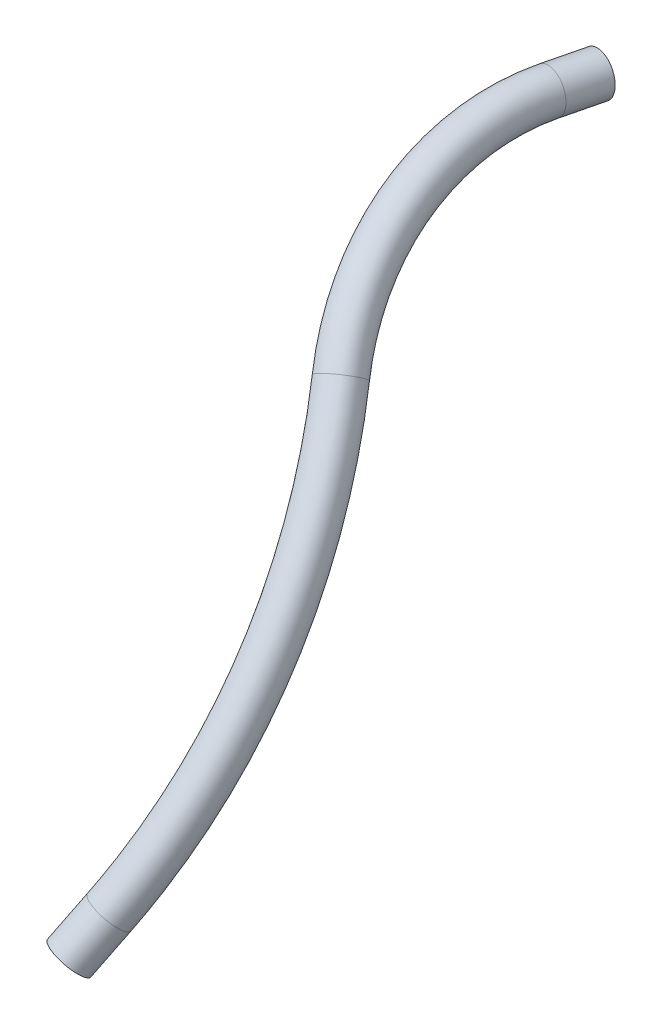
ISO-10303-21;
HEADER;
FILE_DESCRIPTION(('STEP AP214'),'2;1');
FILE_NAME('part.step','',(''),(''),'','','');
FILE_SCHEMA(('AUTOMOTIVE_DESIGN { 1 0 10303 214 1 1 1 1 }'));
ENDSEC;
DATA;
#1=APPLICATION_CONTEXT('core data for automotive mechanical design processes');
#2=APPLICATION_PROTOCOL_DEFINITION('international standard','automotive_design',2000,#1);
#3=PRODUCT_CONTEXT('',#1,'mechanical');
#4=PRODUCT('Part','Part','',(#3));
#5=PRODUCT_RELATED_PRODUCT_CATEGORY('part','',(#4));
#6=PRODUCT_DEFINITION_FORMATION('','',#4);
#7=PRODUCT_DEFINITION_CONTEXT('part definition',#1,'design');
#8=PRODUCT_DEFINITION('design','',#6,#7);
#9=PRODUCT_DEFINITION_SHAPE('','',#8);
#10=(LENGTH_UNIT() NAMED_UNIT(*) SI_UNIT(.MILLI.,.METRE.));
#11=(NAMED_UNIT(*) PLANE_ANGLE_UNIT() SI_UNIT($,.RADIAN.));
#12=(NAMED_UNIT(*) SI_UNIT($,.STERADIAN.) SOLID_ANGLE_UNIT());
#13=UNCERTAINTY_MEASURE_WITH_UNIT(LENGTH_MEASURE(1.E-05),#10,'distance_accuracy_value','');
#14=(GEOMETRIC_REPRESENTATION_CONTEXT(3) GLOBAL_UNCERTAINTY_ASSIGNED_CONTEXT((#13)) GLOBAL_UNIT_ASSIGNED_CONTEXT((#10,
#11,#12)) REPRESENTATION_CONTEXT('',''));
#15=CARTESIAN_POINT('',(0.,0.,0.));
#16=DIRECTION('',(0.,0.,1.));
#17=DIRECTION('',(1.,0.,0.));
#18=AXIS2_PLACEMENT_3D('',#15,#16,#17);
#19=CARTESIAN_POINT('',(63.0805870079191,56.0149638985559,-75.8190557243082));
#20=DIRECTION('',(0.169140527101116,-0.0574278294622898,-0.983917438861212));
#21=DIRECTION('',(-0.125092606532321,0.988976689373794,-0.0792271901950332));
#22=AXIS2_PLACEMENT_3D('',#19,#20,#21);
#23=PLANE('',#22);
#24=CARTESIAN_POINT('',(63.0805870079191,56.014963898556,-75.8190557243082));
#25=DIRECTION('',(0.169140527101116,-0.0574278294622898,-0.983917438861212));
#26=DIRECTION('',(-0.985543921030288,0.,-0.169420127848631));
#27=AXIS2_PLACEMENT_3D('',#24,#25,#26);
#28=CIRCLE('',#27,6.35);
#29=CARTESIAN_POINT('',(56.8223831093768,56.014963898556,-76.894873536147));
#30=VERTEX_POINT('',#29);
#31=EDGE_CURVE('E94',#30,#30,#28,.T.);
#32=ORIENTED_EDGE('',*,*,#31,.F.);
#33=EDGE_LOOP('',(#32));
#34=FACE_BOUND('',#33,.T.);
#35=CARTESIAN_POINT('',(63.0805870079191,56.0149638985559,-75.8190557243082));
#36=DIRECTION('',(0.169140527101116,-0.0574278294622898,-0.983917438861212));
#37=DIRECTION('',(-0.125092606532321,0.988976689373794,-0.0792271901950332));
#38=AXIS2_PLACEMENT_3D('',#35,#36,#37);
#39=CIRCLE('',#38,10.31875);
#40=CARTESIAN_POINT('',(61.7897876742637,66.2199671120318,-76.6365812931332));
#41=VERTEX_POINT('',#40);
#42=EDGE_CURVE('E90',#41,#41,#39,.T.);
#43=ORIENTED_EDGE('',*,*,#42,.T.);
#44=EDGE_LOOP('',(#43));
#45=FACE_BOUND('',#44,.T.);
#46=ADVANCED_FACE('F65',(#34,#45),#23,.T.);
#47=CARTESIAN_POINT('',(78.4354279494666,-182.543002732796,207.622217663429));
#48=DIRECTION('',(0.310246679702016,0.750260254488817,-0.583829211557841));
#49=DIRECTION('',(0.,0.614132932930022,0.789202598000519));
#50=AXIS2_PLACEMENT_3D('',#47,#48,#49);
#51=PLANE('',#50);
#52=CARTESIAN_POINT('',(78.4354279494662,-182.543002732797,207.622217663428));
#53=DIRECTION('',(0.310246679702016,0.750260254488817,-0.583829211557841));
#54=DIRECTION('',(0.,0.614132932930022,0.789202598000519));
#55=AXIS2_PLACEMENT_3D('',#52,#53,#54);
#56=CIRCLE('',#55,6.35);
#57=CARTESIAN_POINT('',(78.4354279494662,-178.643258608691,212.633654160731));
#58=VERTEX_POINT('',#57);
#59=EDGE_CURVE('E98',#58,#58,#56,.T.);
#60=ORIENTED_EDGE('',*,*,#59,.T.);
#61=EDGE_LOOP('',(#60));
#62=FACE_BOUND('',#61,.T.);
#63=CARTESIAN_POINT('',(78.4354279494666,-182.543002732796,207.622217663429));
#64=DIRECTION('',(0.310246679702016,0.750260254488817,-0.583829211557841));
#65=DIRECTION('',(0.,0.614132932930022,0.789202598000519));
#66=AXIS2_PLACEMENT_3D('',#63,#64,#65);
#67=CIRCLE('',#66,10.31875);
#68=CARTESIAN_POINT('',(78.4354279494666,-176.205918531124,215.765801971547));
#69=VERTEX_POINT('',#68);
#70=EDGE_CURVE('E11',#69,#69,#67,.T.);
#71=ORIENTED_EDGE('',*,*,#70,.F.);
#72=EDGE_LOOP('',(#71));
#73=FACE_BOUND('',#72,.T.);
#74=ADVANCED_FACE('F116',(#62,#73),#51,.F.);
#75=CARTESIAN_POINT('',(63.0805870079191,56.0149638985559,-75.8190557243082));
#76=DIRECTION('',(-0.169140527101115,0.0574278294622845,0.983917438861212));
#77=DIRECTION('',(0.985543921030288,0.,0.16942012784863));
#78=AXIS2_PLACEMENT_3D('',#75,#76,#77);
#79=CYLINDRICAL_SURFACE('',#78,10.31875);
#80=CARTESIAN_POINT('',(59.4245030153889,57.2563042894209,-54.5510316744527));
#81=DIRECTION('',(0.169140527101116,-0.0574278294622898,-0.983917438861212));
#82=DIRECTION('',(-0.125092606532321,0.988976689373794,-0.0792271901950332));
#83=AXIS2_PLACEMENT_3D('',#80,#81,#82);
#84=CIRCLE('',#83,10.31875);
#85=CARTESIAN_POINT('',(54.198597188445,66.0412508806782,-55.9621387714415));
#86=VERTEX_POINT('',#85);
#87=EDGE_CURVE('E84',#86,#86,#84,.T.);
#88=ORIENTED_EDGE('',*,*,#87,.T.);
#89=EDGE_LOOP('',(#88));
#90=FACE_BOUND('',#89,.T.);
#91=ORIENTED_EDGE('',*,*,#42,.F.);
#92=EDGE_LOOP('',(#91));
#93=FACE_BOUND('',#92,.T.);
#94=ADVANCED_FACE('F148',(#90,#93),#79,.T.);
#95=CARTESIAN_POINT('',(123.743343962391,-50.8661152952833,-37.1835597115141));
#96=DIRECTION('',(0.845518979364868,0.521432855254496,0.114914894573926));
#97=DIRECTION('',(-0.524910206670409,0.851157608750123,0.));
#98=AXIS2_PLACEMENT_3D('',#95,#96,#97);
#99=TOROIDAL_SURFACE('',#98,127.,10.31875);
#100=CARTESIAN_POINT('',(76.9471085284022,1.71946919743728,68.5229616235752));
#101=DIRECTION('',(-0.386425089296745,0.746098066872506,-0.542229955803913));
#102=DIRECTION('',(0.00131300788638899,0.588341763394364,0.808611306782375));
#103=AXIS2_PLACEMENT_3D('',#100,#101,#102);
#104=CIRCLE('',#103,10.31875);
#105=CARTESIAN_POINT('',(73.1449143993906,5.99204793747082,77.1116164820512));
#106=VERTEX_POINT('',#105);
#107=EDGE_CURVE('E78',#106,#106,#104,.T.);
#108=CARTESIAN_POINT('',(123.743343962391,-50.8661152952833,-37.1835597115141));
#109=DIRECTION('',(0.845518979364868,0.521432855254496,0.114914894573926));
#110=DIRECTION('',(-0.524910206670409,0.851157608750123,0.));
#111=AXIS2_PLACEMENT_3D('',#108,#109,#110);
#112=CIRCLE('',#111,137.31875);
#113=EDGE_CURVE('',#86,#106,#112,.T.);
#114=ORIENTED_EDGE('',*,*,#87,.F.);
#115=ORIENTED_EDGE('',*,*,#107,.T.);
#116=ORIENTED_EDGE('',*,*,#113,.T.);
#117=ORIENTED_EDGE('',*,*,#113,.F.);
#118=EDGE_LOOP('',(#114,#116,#115,#117));
#119=FACE_BOUND('',#118,.T.);
#120=ADVANCED_FACE('F150',(#119),#99,.T.);
#121=CARTESIAN_POINT('',(-199.613715506589,-83.5926500808014,148.228690506325));
#122=DIRECTION('',(-0.0440030735768875,-0.602141423009574,-0.797175912965133));
#123=DIRECTION('',(0.,0.797948809644686,-0.602725225278177));
#124=AXIS2_PLACEMENT_3D('',#121,#122,#123);
#125=TOROIDAL_SURFACE('',#124,300.195020450687,10.31875);
#126=CARTESIAN_POINT('',(85.4626298321512,-165.549330865263,194.39827038842));
#127=DIRECTION('',(0.310246679702016,0.750260254488817,-0.583829211557841));
#128=DIRECTION('',(0.,0.614132932930022,0.789202598000519));
#129=AXIS2_PLACEMENT_3D('',#126,#127,#128);
#130=CIRCLE('',#129,10.31875);
#131=CARTESIAN_POINT('',(85.4626298321512,-159.212246663592,202.541854696538));
#132=VERTEX_POINT('',#131);
#133=EDGE_CURVE('E72',#132,#132,#130,.T.);
#134=ORIENTED_EDGE('',*,*,#133,.T.);
#135=EDGE_LOOP('',(#134));
#136=FACE_BOUND('',#135,.T.);
#137=ORIENTED_EDGE('',*,*,#107,.F.);
#138=EDGE_LOOP('',(#137));
#139=FACE_BOUND('',#138,.T.);
#140=ADVANCED_FACE('F157',(#136,#139),#125,.T.);
#141=CARTESIAN_POINT('',(85.4626298321518,-165.549330865263,194.398270388421));
#142=DIRECTION('',(-0.310246679702016,-0.750260254488821,0.583829211557836));
#143=DIRECTION('',(0.,-0.614132932930018,-0.789202598000523));
#144=AXIS2_PLACEMENT_3D('',#141,#142,#143);
#145=CYLINDRICAL_SURFACE('',#144,10.31875);
#146=ORIENTED_EDGE('',*,*,#70,.T.);
#147=EDGE_LOOP('',(#146));
#148=FACE_BOUND('',#147,.T.);
#149=ORIENTED_EDGE('',*,*,#133,.F.);
#150=EDGE_LOOP('',(#149));
#151=FACE_BOUND('',#150,.T.);
#152=ADVANCED_FACE('F140',(#148,#151),#145,.T.);
#153=CARTESIAN_POINT('',(63.7571491163235,55.7852525807069,-79.754725479753));
#154=DIRECTION('',(-0.169140527101116,0.0574278294622845,0.983917438861212));
#155=DIRECTION('',(0.985543921030288,0.,0.16942012784863));
#156=AXIS2_PLACEMENT_3D('',#153,#154,#155);
#157=CYLINDRICAL_SURFACE('',#156,6.35);
#158=CARTESIAN_POINT('',(59.4245030153889,57.256304289421,-54.5510316744527));
#159=DIRECTION('',(0.169140527101118,-0.0574278294622922,-0.983917438861212));
#160=DIRECTION('',(-0.12509260653232,0.988976689373794,-0.0792271901950358));
#161=AXIS2_PLACEMENT_3D('',#158,#159,#160);
#162=CIRCLE('',#161,6.35);
#163=CARTESIAN_POINT('',(56.2085609680388,62.6624252686562,-55.4194052725997));
#164=VERTEX_POINT('',#163);
#165=EDGE_CURVE('E99',#164,#164,#162,.T.);
#166=ORIENTED_EDGE('',*,*,#165,.F.);
#167=EDGE_LOOP('',(#166));
#168=FACE_BOUND('',#167,.T.);
#169=ORIENTED_EDGE('',*,*,#31,.T.);
#170=EDGE_LOOP('',(#169));
#171=FACE_BOUND('',#170,.T.);
#172=ADVANCED_FACE('F124',(#168,#171),#157,.F.);
#173=CARTESIAN_POINT('',(123.743343962391,-50.8661152952833,-37.1835597115141));
#174=DIRECTION('',(0.845518979364868,0.521432855254496,0.114914894573926));
#175=DIRECTION('',(-0.524910206670409,0.851157608750123,0.));
#176=AXIS2_PLACEMENT_3D('',#173,#174,#175);
#177=TOROIDAL_SURFACE('',#176,127.,6.35);
#178=CARTESIAN_POINT('',(76.9471085284022,1.71946919743736,68.5229616235752));
#179=DIRECTION('',(-0.386425089296744,0.746098066872505,-0.542229955803915));
#180=DIRECTION('',(0.00131300788638816,0.588341763394366,0.808611306782373));
#181=AXIS2_PLACEMENT_3D('',#178,#179,#180);
#182=CIRCLE('',#181,6.35);
#183=CARTESIAN_POINT('',(74.6072967567028,4.34874842207338,73.8082876903297));
#184=VERTEX_POINT('',#183);
#185=EDGE_CURVE('E103',#184,#184,#182,.T.);
#186=CARTESIAN_POINT('',(123.743343962391,-50.8661152952833,-37.1835597115141));
#187=DIRECTION('',(0.845518979364868,0.521432855254496,0.114914894573926));
#188=DIRECTION('',(-0.524910206670409,0.851157608750123,0.));
#189=AXIS2_PLACEMENT_3D('',#186,#187,#188);
#190=CIRCLE('',#189,133.35);
#191=EDGE_CURVE('',#164,#184,#190,.T.);
#192=ORIENTED_EDGE('',*,*,#165,.T.);
#193=ORIENTED_EDGE('',*,*,#185,.F.);
#194=ORIENTED_EDGE('',*,*,#191,.T.);
#195=ORIENTED_EDGE('',*,*,#191,.F.);
#196=EDGE_LOOP('',(#192,#194,#193,#195));
#197=FACE_BOUND('',#196,.T.);
#198=ADVANCED_FACE('F129',(#197),#177,.F.);
#199=CARTESIAN_POINT('',(-199.613715506589,-83.5926500808014,148.228690506325));
#200=DIRECTION('',(-0.0440030735768875,-0.602141423009574,-0.797175912965133));
#201=DIRECTION('',(0.,0.797948809644686,-0.602725225278177));
#202=AXIS2_PLACEMENT_3D('',#199,#200,#201);
#203=TOROIDAL_SURFACE('',#202,300.195020450686,6.35);
#204=CARTESIAN_POINT('',(85.4626298321515,-165.549330865264,194.398270388419));
#205=DIRECTION('',(0.310246679702016,0.750260254488817,-0.583829211557841));
#206=DIRECTION('',(0.,0.614132932930022,0.789202598000519));
#207=AXIS2_PLACEMENT_3D('',#204,#205,#206);
#208=CIRCLE('',#207,6.35);
#209=CARTESIAN_POINT('',(85.4626298321515,-161.649586741158,199.409706885723));
#210=VERTEX_POINT('',#209);
#211=EDGE_CURVE('E107',#210,#210,#208,.T.);
#212=ORIENTED_EDGE('',*,*,#211,.F.);
#213=EDGE_LOOP('',(#212));
#214=FACE_BOUND('',#213,.T.);
#215=ORIENTED_EDGE('',*,*,#185,.T.);
#216=EDGE_LOOP('',(#215));
#217=FACE_BOUND('',#216,.T.);
#218=ADVANCED_FACE('F122',(#214,#217),#203,.F.);
#219=CARTESIAN_POINT('',(85.4626298321514,-165.549330865263,194.39827038842));
#220=DIRECTION('',(-0.310246679702016,-0.750260254488821,0.583829211557836));
#221=DIRECTION('',(0.,-0.614132932930017,-0.789202598000523));
#222=AXIS2_PLACEMENT_3D('',#219,#220,#221);
#223=CYLINDRICAL_SURFACE('',#222,6.35);
#224=ORIENTED_EDGE('',*,*,#59,.F.);
#225=EDGE_LOOP('',(#224));
#226=FACE_BOUND('',#225,.T.);
#227=ORIENTED_EDGE('',*,*,#211,.T.);
#228=EDGE_LOOP('',(#227));
#229=FACE_BOUND('',#228,.T.);
#230=ADVANCED_FACE('F119',(#226,#229),#223,.F.);
#231=CLOSED_SHELL('',(#46,#74,#94,#120,#140,#152,#172,#198,#218,#230));
#232=MANIFOLD_SOLID_BREP('B2',#231);
#233=ADVANCED_BREP_SHAPE_REPRESENTATION('',(#18,#232),#14);
#234=SHAPE_DEFINITION_REPRESENTATION(#9,#233);
ENDSEC;
END-ISO-10303-21;
